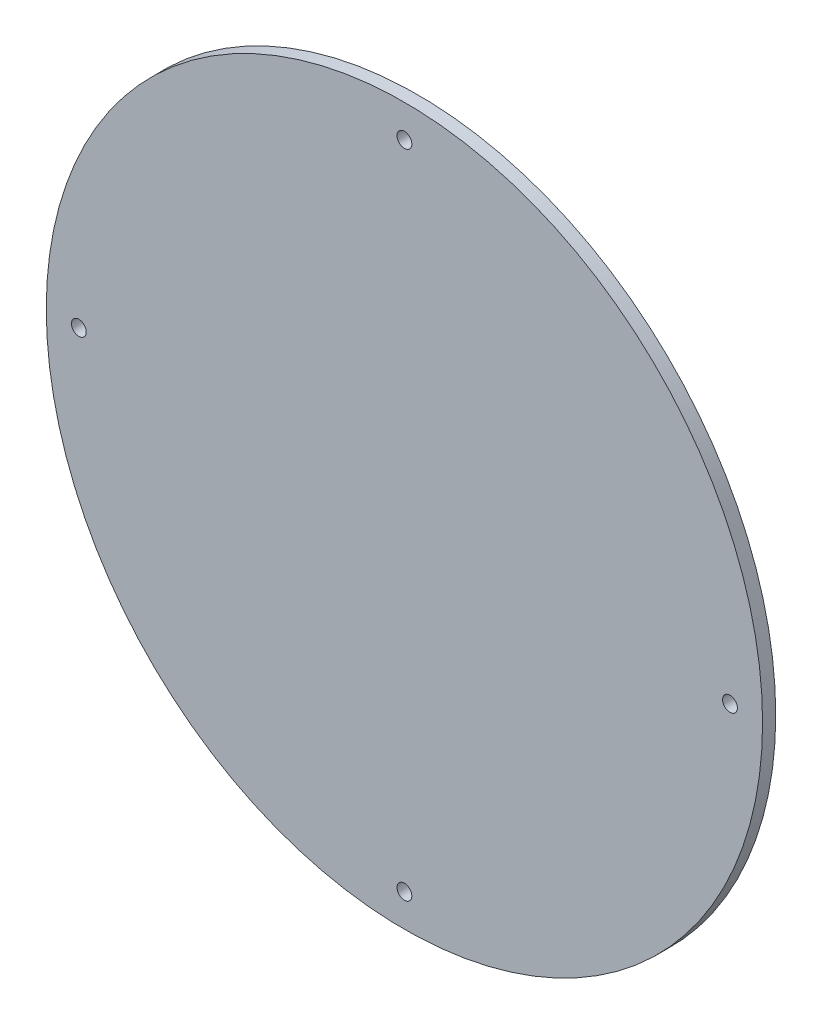
ISO-10303-21;
HEADER;
FILE_DESCRIPTION(('STEP AP214'),'2;1');
FILE_NAME('part.step','',(''),(''),'','','');
FILE_SCHEMA(('AUTOMOTIVE_DESIGN { 1 0 10303 214 1 1 1 1 }'));
ENDSEC;
DATA;
#1=APPLICATION_CONTEXT('core data for automotive mechanical design processes');
#2=APPLICATION_PROTOCOL_DEFINITION('international standard','automotive_design',2000,#1);
#3=PRODUCT_CONTEXT('',#1,'mechanical');
#4=PRODUCT('Part','Part','',(#3));
#5=PRODUCT_RELATED_PRODUCT_CATEGORY('part','',(#4));
#6=PRODUCT_DEFINITION_FORMATION('','',#4);
#7=PRODUCT_DEFINITION_CONTEXT('part definition',#1,'design');
#8=PRODUCT_DEFINITION('design','',#6,#7);
#9=PRODUCT_DEFINITION_SHAPE('','',#8);
#10=(LENGTH_UNIT() NAMED_UNIT(*) SI_UNIT(.MILLI.,.METRE.));
#11=(NAMED_UNIT(*) PLANE_ANGLE_UNIT() SI_UNIT($,.RADIAN.));
#12=(NAMED_UNIT(*) SI_UNIT($,.STERADIAN.) SOLID_ANGLE_UNIT());
#13=UNCERTAINTY_MEASURE_WITH_UNIT(LENGTH_MEASURE(1.E-05),#10,'distance_accuracy_value','');
#14=(GEOMETRIC_REPRESENTATION_CONTEXT(3) GLOBAL_UNCERTAINTY_ASSIGNED_CONTEXT((#13)) GLOBAL_UNIT_ASSIGNED_CONTEXT((#10,
#11,#12)) REPRESENTATION_CONTEXT('',''));
#15=CARTESIAN_POINT('',(0.,0.,0.));
#16=DIRECTION('',(0.,0.,1.));
#17=DIRECTION('',(1.,0.,0.));
#18=AXIS2_PLACEMENT_3D('',#15,#16,#17);
#19=CARTESIAN_POINT('',(0.,78.5,3.175));
#20=DIRECTION('',(0.,0.,-1.));
#21=DIRECTION('',(-1.,0.,0.));
#22=AXIS2_PLACEMENT_3D('',#19,#20,#21);
#23=CYLINDRICAL_SURFACE('',#22,1.7859375);
#24=CARTESIAN_POINT('',(0.,78.5,3.175));
#25=DIRECTION('',(0.,0.,1.));
#26=DIRECTION('',(1.,0.,0.));
#27=AXIS2_PLACEMENT_3D('',#24,#25,#26);
#28=CIRCLE('',#27,1.7859375);
#29=CARTESIAN_POINT('',(1.7859375,78.5,3.175));
#30=VERTEX_POINT('',#29);
#31=EDGE_CURVE('E44',#30,#30,#28,.T.);
#32=ORIENTED_EDGE('',*,*,#31,.T.);
#33=EDGE_LOOP('',(#32));
#34=FACE_BOUND('',#33,.T.);
#35=CARTESIAN_POINT('',(0.,78.5,0.));
#36=DIRECTION('',(0.,0.,1.));
#37=DIRECTION('',(1.,0.,0.));
#38=AXIS2_PLACEMENT_3D('',#35,#36,#37);
#39=CIRCLE('',#38,1.7859375);
#40=CARTESIAN_POINT('',(1.7859375,78.5,0.));
#41=VERTEX_POINT('',#40);
#42=EDGE_CURVE('E61',#41,#41,#39,.T.);
#43=ORIENTED_EDGE('',*,*,#42,.F.);
#44=EDGE_LOOP('',(#43));
#45=FACE_BOUND('',#44,.T.);
#46=ADVANCED_FACE('F36',(#34,#45),#23,.F.);
#47=CARTESIAN_POINT('',(78.5,0.,3.175));
#48=DIRECTION('',(0.,0.,-1.));
#49=DIRECTION('',(-1.,0.,0.));
#50=AXIS2_PLACEMENT_3D('',#47,#48,#49);
#51=CYLINDRICAL_SURFACE('',#50,1.7859375);
#52=CARTESIAN_POINT('',(78.5,0.,3.175));
#53=DIRECTION('',(0.,0.,1.));
#54=DIRECTION('',(1.,0.,0.));
#55=AXIS2_PLACEMENT_3D('',#52,#53,#54);
#56=CIRCLE('',#55,1.7859375);
#57=CARTESIAN_POINT('',(80.2859375,0.,3.175));
#58=VERTEX_POINT('',#57);
#59=EDGE_CURVE('E49',#58,#58,#56,.T.);
#60=ORIENTED_EDGE('',*,*,#59,.T.);
#61=EDGE_LOOP('',(#60));
#62=FACE_BOUND('',#61,.T.);
#63=CARTESIAN_POINT('',(78.5,0.,0.));
#64=DIRECTION('',(0.,0.,1.));
#65=DIRECTION('',(1.,0.,0.));
#66=AXIS2_PLACEMENT_3D('',#63,#64,#65);
#67=CIRCLE('',#66,1.7859375);
#68=CARTESIAN_POINT('',(80.2859375,0.,0.));
#69=VERTEX_POINT('',#68);
#70=EDGE_CURVE('E59',#69,#69,#67,.T.);
#71=ORIENTED_EDGE('',*,*,#70,.F.);
#72=EDGE_LOOP('',(#71));
#73=FACE_BOUND('',#72,.T.);
#74=ADVANCED_FACE('F79',(#62,#73),#51,.F.);
#75=CARTESIAN_POINT('',(0.,-78.5,3.175));
#76=DIRECTION('',(0.,0.,-1.));
#77=DIRECTION('',(-1.,0.,0.));
#78=AXIS2_PLACEMENT_3D('',#75,#76,#77);
#79=CYLINDRICAL_SURFACE('',#78,1.7859375);
#80=CARTESIAN_POINT('',(0.,-78.5,3.175));
#81=DIRECTION('',(0.,0.,1.));
#82=DIRECTION('',(1.,0.,0.));
#83=AXIS2_PLACEMENT_3D('',#80,#81,#82);
#84=CIRCLE('',#83,1.7859375);
#85=CARTESIAN_POINT('',(1.78593750000003,-78.5,3.175));
#86=VERTEX_POINT('',#85);
#87=EDGE_CURVE('E70',#86,#86,#84,.T.);
#88=ORIENTED_EDGE('',*,*,#87,.T.);
#89=EDGE_LOOP('',(#88));
#90=FACE_BOUND('',#89,.T.);
#91=CARTESIAN_POINT('',(0.,-78.5,0.));
#92=DIRECTION('',(0.,0.,1.));
#93=DIRECTION('',(1.,0.,0.));
#94=AXIS2_PLACEMENT_3D('',#91,#92,#93);
#95=CIRCLE('',#94,1.7859375);
#96=CARTESIAN_POINT('',(1.78593750000003,-78.5,0.));
#97=VERTEX_POINT('',#96);
#98=EDGE_CURVE('E56',#97,#97,#95,.T.);
#99=ORIENTED_EDGE('',*,*,#98,.F.);
#100=EDGE_LOOP('',(#99));
#101=FACE_BOUND('',#100,.T.);
#102=ADVANCED_FACE('F97',(#90,#101),#79,.F.);
#103=CARTESIAN_POINT('',(-78.5,0.,3.175));
#104=DIRECTION('',(0.,0.,-1.));
#105=DIRECTION('',(-1.,0.,0.));
#106=AXIS2_PLACEMENT_3D('',#103,#104,#105);
#107=CYLINDRICAL_SURFACE('',#106,1.7859375);
#108=CARTESIAN_POINT('',(-78.5,0.,3.175));
#109=DIRECTION('',(0.,0.,1.));
#110=DIRECTION('',(1.,0.,0.));
#111=AXIS2_PLACEMENT_3D('',#108,#109,#110);
#112=CIRCLE('',#111,1.7859375);
#113=CARTESIAN_POINT('',(-76.7140625,0.,3.175));
#114=VERTEX_POINT('',#113);
#115=EDGE_CURVE('E66',#114,#114,#112,.T.);
#116=ORIENTED_EDGE('',*,*,#115,.T.);
#117=EDGE_LOOP('',(#116));
#118=FACE_BOUND('',#117,.T.);
#119=CARTESIAN_POINT('',(-78.5,0.,0.));
#120=DIRECTION('',(0.,0.,1.));
#121=DIRECTION('',(1.,0.,0.));
#122=AXIS2_PLACEMENT_3D('',#119,#120,#121);
#123=CIRCLE('',#122,1.7859375);
#124=CARTESIAN_POINT('',(-76.7140625,0.,0.));
#125=VERTEX_POINT('',#124);
#126=EDGE_CURVE('E53',#125,#125,#123,.T.);
#127=ORIENTED_EDGE('',*,*,#126,.F.);
#128=EDGE_LOOP('',(#127));
#129=FACE_BOUND('',#128,.T.);
#130=ADVANCED_FACE('F38',(#118,#129),#107,.F.);
#131=CARTESIAN_POINT('',(0.,0.,3.175));
#132=DIRECTION('',(0.,0.,-1.));
#133=DIRECTION('',(-1.,0.,0.));
#134=AXIS2_PLACEMENT_3D('',#131,#132,#133);
#135=CYLINDRICAL_SURFACE('',#134,86.36);
#136=CARTESIAN_POINT('',(0.,0.,3.175));
#137=DIRECTION('',(0.,0.,1.));
#138=DIRECTION('',(1.,0.,0.));
#139=AXIS2_PLACEMENT_3D('',#136,#137,#138);
#140=CIRCLE('',#139,86.36);
#141=CARTESIAN_POINT('',(86.36,0.,3.175));
#142=VERTEX_POINT('',#141);
#143=EDGE_CURVE('E10',#142,#142,#140,.T.);
#144=ORIENTED_EDGE('',*,*,#143,.F.);
#145=EDGE_LOOP('',(#144));
#146=FACE_BOUND('',#145,.T.);
#147=CARTESIAN_POINT('',(0.,0.,0.));
#148=DIRECTION('',(0.,0.,1.));
#149=DIRECTION('',(1.,0.,0.));
#150=AXIS2_PLACEMENT_3D('',#147,#148,#149);
#151=CIRCLE('',#150,86.36);
#152=CARTESIAN_POINT('',(86.36,0.,0.));
#153=VERTEX_POINT('',#152);
#154=EDGE_CURVE('E40',#153,#153,#151,.T.);
#155=ORIENTED_EDGE('',*,*,#154,.T.);
#156=EDGE_LOOP('',(#155));
#157=FACE_BOUND('',#156,.T.);
#158=ADVANCED_FACE('F86',(#146,#157),#135,.T.);
#159=CARTESIAN_POINT('',(0.,0.,3.175));
#160=DIRECTION('',(0.,0.,1.));
#161=DIRECTION('',(1.,0.,0.));
#162=AXIS2_PLACEMENT_3D('',#159,#160,#161);
#163=PLANE('',#162);
#164=ORIENTED_EDGE('',*,*,#115,.F.);
#165=EDGE_LOOP('',(#164));
#166=FACE_BOUND('',#165,.T.);
#167=ORIENTED_EDGE('',*,*,#87,.F.);
#168=EDGE_LOOP('',(#167));
#169=FACE_BOUND('',#168,.T.);
#170=ORIENTED_EDGE('',*,*,#59,.F.);
#171=EDGE_LOOP('',(#170));
#172=FACE_BOUND('',#171,.T.);
#173=ORIENTED_EDGE('',*,*,#31,.F.);
#174=EDGE_LOOP('',(#173));
#175=FACE_BOUND('',#174,.T.);
#176=ORIENTED_EDGE('',*,*,#143,.T.);
#177=EDGE_LOOP('',(#176));
#178=FACE_BOUND('',#177,.T.);
#179=ADVANCED_FACE('F82',(#166,#169,#172,#175,#178),#163,.T.);
#180=CARTESIAN_POINT('',(0.,0.,0.));
#181=DIRECTION('',(0.,0.,1.));
#182=DIRECTION('',(1.,0.,0.));
#183=AXIS2_PLACEMENT_3D('',#180,#181,#182);
#184=PLANE('',#183);
#185=ORIENTED_EDGE('',*,*,#126,.T.);
#186=EDGE_LOOP('',(#185));
#187=FACE_BOUND('',#186,.T.);
#188=ORIENTED_EDGE('',*,*,#98,.T.);
#189=EDGE_LOOP('',(#188));
#190=FACE_BOUND('',#189,.T.);
#191=ORIENTED_EDGE('',*,*,#70,.T.);
#192=EDGE_LOOP('',(#191));
#193=FACE_BOUND('',#192,.T.);
#194=ORIENTED_EDGE('',*,*,#42,.T.);
#195=EDGE_LOOP('',(#194));
#196=FACE_BOUND('',#195,.T.);
#197=ORIENTED_EDGE('',*,*,#154,.F.);
#198=EDGE_LOOP('',(#197));
#199=FACE_BOUND('',#198,.T.);
#200=ADVANCED_FACE('F85',(#187,#190,#193,#196,#199),#184,.F.);
#201=CLOSED_SHELL('',(#46,#74,#102,#130,#158,#179,#200));
#202=MANIFOLD_SOLID_BREP('B2',#201);
#203=ADVANCED_BREP_SHAPE_REPRESENTATION('',(#18,#202),#14);
#204=SHAPE_DEFINITION_REPRESENTATION(#9,#203);
ENDSEC;
END-ISO-10303-21;
